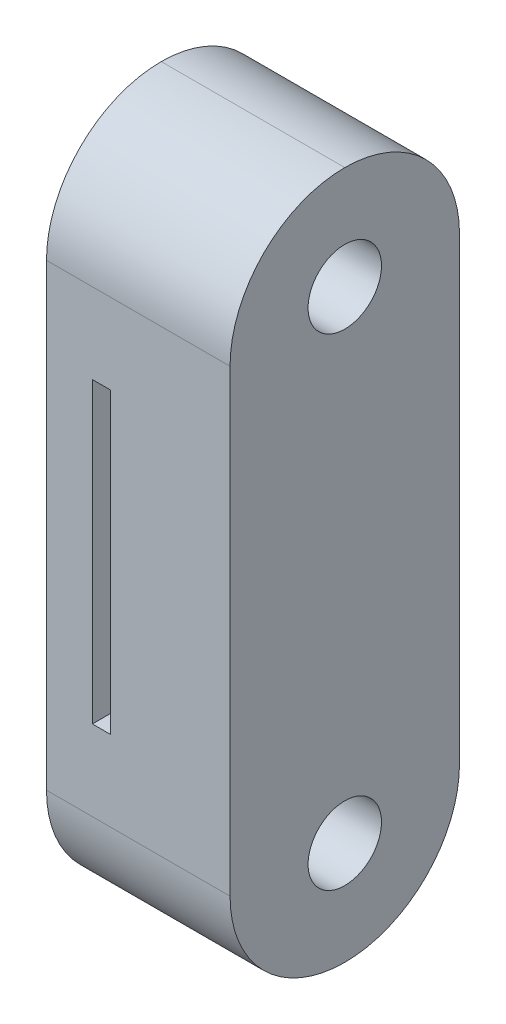
ISO-10303-21;
HEADER;
FILE_DESCRIPTION(('STEP AP214'),'2;1');
FILE_NAME('part.step','',(''),(''),'','','');
FILE_SCHEMA(('AUTOMOTIVE_DESIGN { 1 0 10303 214 1 1 1 1 }'));
ENDSEC;
DATA;
#1=APPLICATION_CONTEXT('core data for automotive mechanical design processes');
#2=APPLICATION_PROTOCOL_DEFINITION('international standard','automotive_design',2000,#1);
#3=PRODUCT_CONTEXT('',#1,'mechanical');
#4=PRODUCT('Part','Part','',(#3));
#5=PRODUCT_RELATED_PRODUCT_CATEGORY('part','',(#4));
#6=PRODUCT_DEFINITION_FORMATION('','',#4);
#7=PRODUCT_DEFINITION_CONTEXT('part definition',#1,'design');
#8=PRODUCT_DEFINITION('design','',#6,#7);
#9=PRODUCT_DEFINITION_SHAPE('','',#8);
#10=(LENGTH_UNIT() NAMED_UNIT(*) SI_UNIT(.MILLI.,.METRE.));
#11=(NAMED_UNIT(*) PLANE_ANGLE_UNIT() SI_UNIT($,.RADIAN.));
#12=(NAMED_UNIT(*) SI_UNIT($,.STERADIAN.) SOLID_ANGLE_UNIT());
#13=UNCERTAINTY_MEASURE_WITH_UNIT(LENGTH_MEASURE(1.E-05),#10,'distance_accuracy_value','');
#14=(GEOMETRIC_REPRESENTATION_CONTEXT(3) GLOBAL_UNCERTAINTY_ASSIGNED_CONTEXT((#13)) GLOBAL_UNIT_ASSIGNED_CONTEXT((#10,
#11,#12)) REPRESENTATION_CONTEXT('',''));
#15=CARTESIAN_POINT('',(0.,0.,0.));
#16=DIRECTION('',(0.,0.,1.));
#17=DIRECTION('',(1.,0.,0.));
#18=AXIS2_PLACEMENT_3D('',#15,#16,#17);
#19=CARTESIAN_POINT('',(0.,15.,5.));
#20=DIRECTION('',(-1.,0.,0.));
#21=DIRECTION('',(0.,0.,1.));
#22=AXIS2_PLACEMENT_3D('',#19,#20,#21);
#23=PLANE('',#22);
#24=CARTESIAN_POINT('',(0.,-10.5,0.));
#25=DIRECTION('',(1.,0.,0.));
#26=DIRECTION('',(0.,0.,-1.));
#27=AXIS2_PLACEMENT_3D('',#24,#25,#26);
#28=CIRCLE('',#27,1.6);
#29=CARTESIAN_POINT('',(0.,-10.5,-1.6));
#30=VERTEX_POINT('',#29);
#31=EDGE_CURVE('E150',#30,#30,#28,.T.);
#32=ORIENTED_EDGE('',*,*,#31,.F.);
#33=EDGE_LOOP('',(#32));
#34=FACE_BOUND('',#33,.T.);
#35=CARTESIAN_POINT('',(0.,10.5,0.));
#36=DIRECTION('',(1.,0.,0.));
#37=DIRECTION('',(0.,0.,-1.));
#38=AXIS2_PLACEMENT_3D('',#35,#36,#37);
#39=CIRCLE('',#38,1.6);
#40=CARTESIAN_POINT('',(0.,10.5,-1.6));
#41=VERTEX_POINT('',#40);
#42=EDGE_CURVE('E149',#41,#41,#39,.T.);
#43=ORIENTED_EDGE('',*,*,#42,.F.);
#44=EDGE_LOOP('',(#43));
#45=FACE_BOUND('',#44,.T.);
#46=CARTESIAN_POINT('',(0.,10.,0.));
#47=DIRECTION('',(-1.,0.,0.));
#48=DIRECTION('',(0.,0.,1.));
#49=AXIS2_PLACEMENT_3D('',#46,#47,#48);
#50=CIRCLE('',#49,5.);
#51=CARTESIAN_POINT('',(0.,10.,-5.));
#52=VERTEX_POINT('',#51);
#53=CARTESIAN_POINT('',(0.,15.,0.));
#54=VERTEX_POINT('',#53);
#55=EDGE_CURVE('E189',#52,#54,#50,.F.);
#56=ORIENTED_EDGE('',*,*,#55,.T.);
#57=CARTESIAN_POINT('',(0.,10.,0.));
#58=DIRECTION('',(-1.,0.,0.));
#59=DIRECTION('',(0.,0.,1.));
#60=AXIS2_PLACEMENT_3D('',#57,#58,#59);
#61=CIRCLE('',#60,5.);
#62=CARTESIAN_POINT('',(0.,10.,5.));
#63=VERTEX_POINT('',#62);
#64=EDGE_CURVE('E191',#54,#63,#61,.F.);
#65=ORIENTED_EDGE('',*,*,#64,.T.);
#66=DIRECTION('',(0.,1.,0.));
#67=VECTOR('',#66,1.);
#68=CARTESIAN_POINT('',(0.,15.,5.));
#69=LINE('',#68,#67);
#70=CARTESIAN_POINT('',(0.,-10.,5.));
#71=VERTEX_POINT('',#70);
#72=EDGE_CURVE('E160',#71,#63,#69,.T.);
#73=ORIENTED_EDGE('',*,*,#72,.F.);
#74=CARTESIAN_POINT('',(0.,-10.,0.));
#75=DIRECTION('',(-1.,0.,0.));
#76=DIRECTION('',(0.,0.,1.));
#77=AXIS2_PLACEMENT_3D('',#74,#75,#76);
#78=CIRCLE('',#77,5.);
#79=CARTESIAN_POINT('',(0.,-15.,0.));
#80=VERTEX_POINT('',#79);
#81=EDGE_CURVE('E187',#71,#80,#78,.F.);
#82=ORIENTED_EDGE('',*,*,#81,.T.);
#83=CARTESIAN_POINT('',(0.,-10.,0.));
#84=DIRECTION('',(-1.,0.,0.));
#85=DIRECTION('',(0.,0.,1.));
#86=AXIS2_PLACEMENT_3D('',#83,#84,#85);
#87=CIRCLE('',#86,5.);
#88=CARTESIAN_POINT('',(0.,-10.,-5.));
#89=VERTEX_POINT('',#88);
#90=EDGE_CURVE('E185',#80,#89,#87,.F.);
#91=ORIENTED_EDGE('',*,*,#90,.T.);
#92=DIRECTION('',(0.,1.,0.));
#93=VECTOR('',#92,1.);
#94=CARTESIAN_POINT('',(0.,15.,-5.));
#95=LINE('',#94,#93);
#96=EDGE_CURVE('E157',#89,#52,#95,.T.);
#97=ORIENTED_EDGE('',*,*,#96,.T.);
#98=EDGE_LOOP('',(#56,#65,#73,#82,#91,#97));
#99=FACE_BOUND('',#98,.T.);
#100=ADVANCED_FACE('F32',(#34,#45,#99),#23,.F.);
#101=CARTESIAN_POINT('',(-7.99999999999999,15.,5.));
#102=DIRECTION('',(1.,0.,0.));
#103=DIRECTION('',(0.,1.,0.));
#104=AXIS2_PLACEMENT_3D('',#101,#102,#103);
#105=PLANE('',#104);
#106=CARTESIAN_POINT('',(-8.,-10.5,0.));
#107=DIRECTION('',(1.,0.,0.));
#108=DIRECTION('',(0.,0.,-1.));
#109=AXIS2_PLACEMENT_3D('',#106,#107,#108);
#110=CIRCLE('',#109,1.6);
#111=CARTESIAN_POINT('',(-8.,-10.5,-1.6));
#112=VERTEX_POINT('',#111);
#113=EDGE_CURVE('E146',#112,#112,#110,.T.);
#114=ORIENTED_EDGE('',*,*,#113,.T.);
#115=EDGE_LOOP('',(#114));
#116=FACE_BOUND('',#115,.T.);
#117=CARTESIAN_POINT('',(-8.,10.5,0.));
#118=DIRECTION('',(1.,0.,0.));
#119=DIRECTION('',(0.,0.,-1.));
#120=AXIS2_PLACEMENT_3D('',#117,#118,#119);
#121=CIRCLE('',#120,1.6);
#122=CARTESIAN_POINT('',(-8.,10.5,-1.6));
#123=VERTEX_POINT('',#122);
#124=EDGE_CURVE('E154',#123,#123,#121,.T.);
#125=ORIENTED_EDGE('',*,*,#124,.T.);
#126=EDGE_LOOP('',(#125));
#127=FACE_BOUND('',#126,.T.);
#128=DIRECTION('',(0.,-1.,0.));
#129=VECTOR('',#128,1.);
#130=CARTESIAN_POINT('',(-7.99999999999999,15.,5.));
#131=LINE('',#130,#129);
#132=CARTESIAN_POINT('',(-7.99999999999999,10.,5.));
#133=VERTEX_POINT('',#132);
#134=CARTESIAN_POINT('',(-8.,-10.,5.));
#135=VERTEX_POINT('',#134);
#136=EDGE_CURVE('E163',#133,#135,#131,.T.);
#137=ORIENTED_EDGE('',*,*,#136,.F.);
#138=CARTESIAN_POINT('',(-7.99999999999999,10.,0.));
#139=DIRECTION('',(1.,0.,0.));
#140=DIRECTION('',(0.,1.,0.));
#141=AXIS2_PLACEMENT_3D('',#138,#139,#140);
#142=CIRCLE('',#141,5.);
#143=CARTESIAN_POINT('',(-7.99999999999999,15.,0.));
#144=VERTEX_POINT('',#143);
#145=EDGE_CURVE('E183',#133,#144,#142,.F.);
#146=ORIENTED_EDGE('',*,*,#145,.T.);
#147=CARTESIAN_POINT('',(-7.99999999999999,10.,0.));
#148=DIRECTION('',(1.,0.,0.));
#149=DIRECTION('',(0.,1.,0.));
#150=AXIS2_PLACEMENT_3D('',#147,#148,#149);
#151=CIRCLE('',#150,5.);
#152=CARTESIAN_POINT('',(-7.99999999999999,10.,-5.));
#153=VERTEX_POINT('',#152);
#154=EDGE_CURVE('E181',#144,#153,#151,.F.);
#155=ORIENTED_EDGE('',*,*,#154,.T.);
#156=DIRECTION('',(0.,-1.,0.));
#157=VECTOR('',#156,1.);
#158=CARTESIAN_POINT('',(-7.99999999999999,15.,-5.));
#159=LINE('',#158,#157);
#160=CARTESIAN_POINT('',(-8.,-10.,-5.));
#161=VERTEX_POINT('',#160);
#162=EDGE_CURVE('E164',#153,#161,#159,.T.);
#163=ORIENTED_EDGE('',*,*,#162,.T.);
#164=CARTESIAN_POINT('',(-8.,-10.,0.));
#165=DIRECTION('',(1.,0.,0.));
#166=DIRECTION('',(0.,1.,0.));
#167=AXIS2_PLACEMENT_3D('',#164,#165,#166);
#168=CIRCLE('',#167,5.);
#169=CARTESIAN_POINT('',(-8.,-15.,0.));
#170=VERTEX_POINT('',#169);
#171=EDGE_CURVE('E177',#161,#170,#168,.F.);
#172=ORIENTED_EDGE('',*,*,#171,.T.);
#173=CARTESIAN_POINT('',(-8.,-10.,0.));
#174=DIRECTION('',(1.,0.,0.));
#175=DIRECTION('',(0.,1.,0.));
#176=AXIS2_PLACEMENT_3D('',#173,#174,#175);
#177=CIRCLE('',#176,5.);
#178=EDGE_CURVE('E179',#170,#135,#177,.F.);
#179=ORIENTED_EDGE('',*,*,#178,.T.);
#180=EDGE_LOOP('',(#137,#146,#155,#163,#172,#179));
#181=FACE_BOUND('',#180,.T.);
#182=ADVANCED_FACE('F222',(#116,#127,#181),#105,.F.);
#183=CARTESIAN_POINT('',(0.,-15.,5.));
#184=DIRECTION('',(0.,0.,1.));
#185=DIRECTION('',(1.,0.,0.));
#186=AXIS2_PLACEMENT_3D('',#183,#184,#185);
#187=PLANE('',#186);
#188=DIRECTION('',(0.,1.,0.));
#189=VECTOR('',#188,1.);
#190=CARTESIAN_POINT('',(-5.19999999999999,6.5,5.));
#191=LINE('',#190,#189);
#192=CARTESIAN_POINT('',(-5.19999999999999,-6.5,5.));
#193=VERTEX_POINT('',#192);
#194=CARTESIAN_POINT('',(-5.19999999999999,6.5,5.));
#195=VERTEX_POINT('',#194);
#196=EDGE_CURVE('E49',#193,#195,#191,.T.);
#197=ORIENTED_EDGE('',*,*,#196,.F.);
#198=DIRECTION('',(1.,0.,0.));
#199=VECTOR('',#198,1.);
#200=CARTESIAN_POINT('',(-5.19999999999999,-6.5,5.));
#201=LINE('',#200,#199);
#202=CARTESIAN_POINT('',(-5.99999999999999,-6.5,5.));
#203=VERTEX_POINT('',#202);
#204=EDGE_CURVE('E128',#203,#193,#201,.T.);
#205=ORIENTED_EDGE('',*,*,#204,.F.);
#206=DIRECTION('',(0.,-1.,0.));
#207=VECTOR('',#206,1.);
#208=CARTESIAN_POINT('',(-5.99999999999999,6.5,5.));
#209=LINE('',#208,#207);
#210=CARTESIAN_POINT('',(-5.99999999999999,6.5,5.));
#211=VERTEX_POINT('',#210);
#212=EDGE_CURVE('E112',#211,#203,#209,.T.);
#213=ORIENTED_EDGE('',*,*,#212,.F.);
#214=DIRECTION('',(-1.,0.,0.));
#215=VECTOR('',#214,1.);
#216=CARTESIAN_POINT('',(-5.19999999999999,6.5,5.));
#217=LINE('',#216,#215);
#218=EDGE_CURVE('E121',#195,#211,#217,.T.);
#219=ORIENTED_EDGE('',*,*,#218,.F.);
#220=EDGE_LOOP('',(#197,#205,#213,#219));
#221=FACE_BOUND('',#220,.T.);
#222=ORIENTED_EDGE('',*,*,#72,.T.);
#223=DIRECTION('',(-1.,0.,0.));
#224=VECTOR('',#223,1.);
#225=CARTESIAN_POINT('',(-7.99999999999999,10.,5.));
#226=LINE('',#225,#224);
#227=EDGE_CURVE('E174',#63,#133,#226,.T.);
#228=ORIENTED_EDGE('',*,*,#227,.T.);
#229=ORIENTED_EDGE('',*,*,#136,.T.);
#230=DIRECTION('',(1.,0.,0.));
#231=VECTOR('',#230,1.);
#232=CARTESIAN_POINT('',(0.,-10.,5.));
#233=LINE('',#232,#231);
#234=EDGE_CURVE('E167',#135,#71,#233,.T.);
#235=ORIENTED_EDGE('',*,*,#234,.T.);
#236=EDGE_LOOP('',(#222,#228,#229,#235));
#237=FACE_BOUND('',#236,.T.);
#238=ADVANCED_FACE('F125',(#221,#237),#187,.T.);
#239=CARTESIAN_POINT('',(0.,-15.,-5.));
#240=DIRECTION('',(0.,0.,1.));
#241=DIRECTION('',(1.,0.,0.));
#242=AXIS2_PLACEMENT_3D('',#239,#240,#241);
#243=PLANE('',#242);
#244=DIRECTION('',(1.,0.,0.));
#245=VECTOR('',#244,1.);
#246=CARTESIAN_POINT('',(-5.19999999999999,-6.5,-5.));
#247=LINE('',#246,#245);
#248=CARTESIAN_POINT('',(-5.99999999999999,-6.5,-5.));
#249=VERTEX_POINT('',#248);
#250=CARTESIAN_POINT('',(-5.19999999999999,-6.5,-5.));
#251=VERTEX_POINT('',#250);
#252=EDGE_CURVE('E139',#249,#251,#247,.T.);
#253=ORIENTED_EDGE('',*,*,#252,.T.);
#254=DIRECTION('',(0.,1.,0.));
#255=VECTOR('',#254,1.);
#256=CARTESIAN_POINT('',(-5.19999999999999,6.5,-5.));
#257=LINE('',#256,#255);
#258=CARTESIAN_POINT('',(-5.19999999999999,6.5,-5.));
#259=VERTEX_POINT('',#258);
#260=EDGE_CURVE('E130',#251,#259,#257,.T.);
#261=ORIENTED_EDGE('',*,*,#260,.T.);
#262=DIRECTION('',(-1.,0.,0.));
#263=VECTOR('',#262,1.);
#264=CARTESIAN_POINT('',(-5.19999999999999,6.5,-5.));
#265=LINE('',#264,#263);
#266=CARTESIAN_POINT('',(-5.99999999999999,6.5,-5.));
#267=VERTEX_POINT('',#266);
#268=EDGE_CURVE('E136',#259,#267,#265,.T.);
#269=ORIENTED_EDGE('',*,*,#268,.T.);
#270=DIRECTION('',(0.,-1.,0.));
#271=VECTOR('',#270,1.);
#272=CARTESIAN_POINT('',(-5.99999999999999,6.5,-5.));
#273=LINE('',#272,#271);
#274=EDGE_CURVE('E57',#267,#249,#273,.T.);
#275=ORIENTED_EDGE('',*,*,#274,.T.);
#276=EDGE_LOOP('',(#253,#261,#269,#275));
#277=FACE_BOUND('',#276,.T.);
#278=ORIENTED_EDGE('',*,*,#162,.F.);
#279=DIRECTION('',(-1.,0.,0.));
#280=VECTOR('',#279,1.);
#281=CARTESIAN_POINT('',(0.,10.,-5.));
#282=LINE('',#281,#280);
#283=EDGE_CURVE('E11',#153,#52,#282,.F.);
#284=ORIENTED_EDGE('',*,*,#283,.T.);
#285=ORIENTED_EDGE('',*,*,#96,.F.);
#286=DIRECTION('',(1.,0.,0.));
#287=VECTOR('',#286,1.);
#288=CARTESIAN_POINT('',(0.,-10.,-5.));
#289=LINE('',#288,#287);
#290=EDGE_CURVE('E41',#89,#161,#289,.F.);
#291=ORIENTED_EDGE('',*,*,#290,.T.);
#292=EDGE_LOOP('',(#278,#284,#285,#291));
#293=FACE_BOUND('',#292,.T.);
#294=ADVANCED_FACE('F213',(#277,#293),#243,.F.);
#295=CARTESIAN_POINT('',(-8.,10.5,0.));
#296=DIRECTION('',(1.,0.,0.));
#297=DIRECTION('',(0.,0.,-1.));
#298=AXIS2_PLACEMENT_3D('',#295,#296,#297);
#299=CYLINDRICAL_SURFACE('',#298,1.6);
#300=ORIENTED_EDGE('',*,*,#124,.F.);
#301=EDGE_LOOP('',(#300));
#302=FACE_BOUND('',#301,.T.);
#303=ORIENTED_EDGE('',*,*,#42,.T.);
#304=EDGE_LOOP('',(#303));
#305=FACE_BOUND('',#304,.T.);
#306=ADVANCED_FACE('F264',(#302,#305),#299,.F.);
#307=CARTESIAN_POINT('',(-8.,-10.5,0.));
#308=DIRECTION('',(1.,0.,0.));
#309=DIRECTION('',(0.,0.,-1.));
#310=AXIS2_PLACEMENT_3D('',#307,#308,#309);
#311=CYLINDRICAL_SURFACE('',#310,1.6);
#312=ORIENTED_EDGE('',*,*,#113,.F.);
#313=EDGE_LOOP('',(#312));
#314=FACE_BOUND('',#313,.T.);
#315=ORIENTED_EDGE('',*,*,#31,.T.);
#316=EDGE_LOOP('',(#315));
#317=FACE_BOUND('',#316,.T.);
#318=ADVANCED_FACE('F239',(#314,#317),#311,.F.);
#319=CARTESIAN_POINT('',(-7.99999999999999,10.,0.));
#320=DIRECTION('',(-1.,0.,0.));
#321=DIRECTION('',(0.,0.,1.));
#322=AXIS2_PLACEMENT_3D('',#319,#320,#321);
#323=CYLINDRICAL_SURFACE('',#322,5.);
#324=DIRECTION('',(-1.,0.,0.));
#325=VECTOR('',#324,1.);
#326=CARTESIAN_POINT('',(-7.99999999999999,15.,0.));
#327=LINE('',#326,#325);
#328=EDGE_CURVE('E153',#54,#144,#327,.T.);
#329=ORIENTED_EDGE('',*,*,#328,.F.);
#330=ORIENTED_EDGE('',*,*,#55,.F.);
#331=ORIENTED_EDGE('',*,*,#283,.F.);
#332=ORIENTED_EDGE('',*,*,#154,.F.);
#333=EDGE_LOOP('',(#329,#330,#331,#332));
#334=FACE_BOUND('',#333,.T.);
#335=ADVANCED_FACE('F217',(#334),#323,.T.);
#336=CARTESIAN_POINT('',(0.,10.,0.));
#337=DIRECTION('',(1.,0.,0.));
#338=DIRECTION('',(0.,0.,-1.));
#339=AXIS2_PLACEMENT_3D('',#336,#337,#338);
#340=CYLINDRICAL_SURFACE('',#339,5.);
#341=ORIENTED_EDGE('',*,*,#64,.F.);
#342=ORIENTED_EDGE('',*,*,#328,.T.);
#343=ORIENTED_EDGE('',*,*,#145,.F.);
#344=ORIENTED_EDGE('',*,*,#227,.F.);
#345=EDGE_LOOP('',(#341,#342,#343,#344));
#346=FACE_BOUND('',#345,.T.);
#347=ADVANCED_FACE('F220',(#346),#340,.T.);
#348=CARTESIAN_POINT('',(-8.,-10.,0.));
#349=DIRECTION('',(1.,0.,0.));
#350=DIRECTION('',(0.,0.,-1.));
#351=AXIS2_PLACEMENT_3D('',#348,#349,#350);
#352=CYLINDRICAL_SURFACE('',#351,5.);
#353=DIRECTION('',(1.,0.,0.));
#354=VECTOR('',#353,1.);
#355=CARTESIAN_POINT('',(-8.,-15.,0.));
#356=LINE('',#355,#354);
#357=EDGE_CURVE('E36',#170,#80,#356,.T.);
#358=ORIENTED_EDGE('',*,*,#357,.F.);
#359=ORIENTED_EDGE('',*,*,#171,.F.);
#360=ORIENTED_EDGE('',*,*,#290,.F.);
#361=ORIENTED_EDGE('',*,*,#90,.F.);
#362=EDGE_LOOP('',(#358,#359,#360,#361));
#363=FACE_BOUND('',#362,.T.);
#364=ADVANCED_FACE('F34',(#363),#352,.T.);
#365=CARTESIAN_POINT('',(0.,-10.,0.));
#366=DIRECTION('',(-1.,0.,0.));
#367=DIRECTION('',(0.,0.,1.));
#368=AXIS2_PLACEMENT_3D('',#365,#366,#367);
#369=CYLINDRICAL_SURFACE('',#368,5.);
#370=ORIENTED_EDGE('',*,*,#178,.F.);
#371=ORIENTED_EDGE('',*,*,#357,.T.);
#372=ORIENTED_EDGE('',*,*,#81,.F.);
#373=ORIENTED_EDGE('',*,*,#234,.F.);
#374=EDGE_LOOP('',(#370,#371,#372,#373));
#375=FACE_BOUND('',#374,.T.);
#376=ADVANCED_FACE('F201',(#375),#369,.T.);
#377=CARTESIAN_POINT('',(-5.19999999999999,6.5,-5.));
#378=DIRECTION('',(1.,0.,0.));
#379=DIRECTION('',(0.,0.,-1.));
#380=AXIS2_PLACEMENT_3D('',#377,#378,#379);
#381=PLANE('',#380);
#382=DIRECTION('',(0.,0.,1.));
#383=VECTOR('',#382,1.);
#384=CARTESIAN_POINT('',(-5.19999999999999,6.5,-5.));
#385=LINE('',#384,#383);
#386=EDGE_CURVE('E118',#259,#195,#385,.T.);
#387=ORIENTED_EDGE('',*,*,#386,.F.);
#388=ORIENTED_EDGE('',*,*,#260,.F.);
#389=DIRECTION('',(0.,0.,1.));
#390=VECTOR('',#389,1.);
#391=CARTESIAN_POINT('',(-5.19999999999999,-6.5,-5.));
#392=LINE('',#391,#390);
#393=EDGE_CURVE('E142',#251,#193,#392,.T.);
#394=ORIENTED_EDGE('',*,*,#393,.T.);
#395=ORIENTED_EDGE('',*,*,#196,.T.);
#396=EDGE_LOOP('',(#387,#388,#394,#395));
#397=FACE_BOUND('',#396,.T.);
#398=ADVANCED_FACE('F241',(#397),#381,.F.);
#399=CARTESIAN_POINT('',(-5.19999999999999,-6.5,-5.));
#400=DIRECTION('',(0.,-1.,0.));
#401=DIRECTION('',(1.,0.,0.));
#402=AXIS2_PLACEMENT_3D('',#399,#400,#401);
#403=PLANE('',#402);
#404=ORIENTED_EDGE('',*,*,#393,.F.);
#405=ORIENTED_EDGE('',*,*,#252,.F.);
#406=DIRECTION('',(0.,0.,1.));
#407=VECTOR('',#406,1.);
#408=CARTESIAN_POINT('',(-5.99999999999999,-6.5,-5.));
#409=LINE('',#408,#407);
#410=EDGE_CURVE('E117',#249,#203,#409,.T.);
#411=ORIENTED_EDGE('',*,*,#410,.T.);
#412=ORIENTED_EDGE('',*,*,#204,.T.);
#413=EDGE_LOOP('',(#404,#405,#411,#412));
#414=FACE_BOUND('',#413,.T.);
#415=ADVANCED_FACE('F246',(#414),#403,.F.);
#416=CARTESIAN_POINT('',(-5.99999999999999,6.5,-5.));
#417=DIRECTION('',(-1.,0.,0.));
#418=DIRECTION('',(0.,0.,1.));
#419=AXIS2_PLACEMENT_3D('',#416,#417,#418);
#420=PLANE('',#419);
#421=ORIENTED_EDGE('',*,*,#410,.F.);
#422=ORIENTED_EDGE('',*,*,#274,.F.);
#423=DIRECTION('',(0.,0.,1.));
#424=VECTOR('',#423,1.);
#425=CARTESIAN_POINT('',(-5.99999999999999,6.5,-5.));
#426=LINE('',#425,#424);
#427=EDGE_CURVE('E108',#267,#211,#426,.T.);
#428=ORIENTED_EDGE('',*,*,#427,.T.);
#429=ORIENTED_EDGE('',*,*,#212,.T.);
#430=EDGE_LOOP('',(#421,#422,#428,#429));
#431=FACE_BOUND('',#430,.T.);
#432=ADVANCED_FACE('F110',(#431),#420,.F.);
#433=CARTESIAN_POINT('',(-5.19999999999999,6.5,-5.));
#434=DIRECTION('',(0.,1.,0.));
#435=DIRECTION('',(-1.,0.,0.));
#436=AXIS2_PLACEMENT_3D('',#433,#434,#435);
#437=PLANE('',#436);
#438=ORIENTED_EDGE('',*,*,#427,.F.);
#439=ORIENTED_EDGE('',*,*,#268,.F.);
#440=ORIENTED_EDGE('',*,*,#386,.T.);
#441=ORIENTED_EDGE('',*,*,#218,.T.);
#442=EDGE_LOOP('',(#438,#439,#440,#441));
#443=FACE_BOUND('',#442,.T.);
#444=ADVANCED_FACE('F122',(#443),#437,.F.);
#445=CLOSED_SHELL('',(#100,#182,#238,#294,#306,#318,#335,#347,#364,#376,#398,#415,#432,#444));
#446=MANIFOLD_SOLID_BREP('B2',#445);
#447=ADVANCED_BREP_SHAPE_REPRESENTATION('',(#18,#446),#14);
#448=SHAPE_DEFINITION_REPRESENTATION(#9,#447);
ENDSEC;
END-ISO-10303-21;
